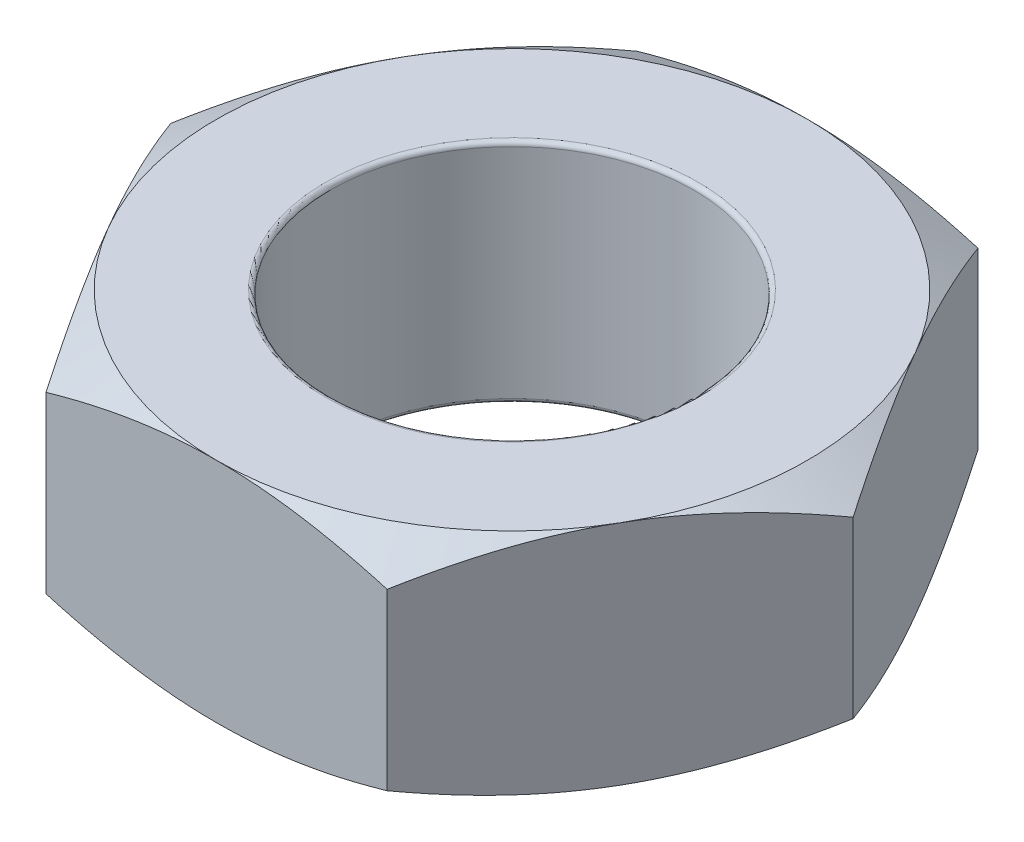
ISO-10303-21;
HEADER;
FILE_DESCRIPTION(('STEP AP214'),'2;1');
FILE_NAME('part.step','',(''),(''),'','','');
FILE_SCHEMA(('AUTOMOTIVE_DESIGN { 1 0 10303 214 1 1 1 1 }'));
ENDSEC;
DATA;
#1=APPLICATION_CONTEXT('core data for automotive mechanical design processes');
#2=APPLICATION_PROTOCOL_DEFINITION('international standard','automotive_design',2000,#1);
#3=PRODUCT_CONTEXT('',#1,'mechanical');
#4=PRODUCT('Part','Part','',(#3));
#5=PRODUCT_RELATED_PRODUCT_CATEGORY('part','',(#4));
#6=PRODUCT_DEFINITION_FORMATION('','',#4);
#7=PRODUCT_DEFINITION_CONTEXT('part definition',#1,'design');
#8=PRODUCT_DEFINITION('design','',#6,#7);
#9=PRODUCT_DEFINITION_SHAPE('','',#8);
#10=(LENGTH_UNIT() NAMED_UNIT(*) SI_UNIT(.MILLI.,.METRE.));
#11=(NAMED_UNIT(*) PLANE_ANGLE_UNIT() SI_UNIT($,.RADIAN.));
#12=(NAMED_UNIT(*) SI_UNIT($,.STERADIAN.) SOLID_ANGLE_UNIT());
#13=UNCERTAINTY_MEASURE_WITH_UNIT(LENGTH_MEASURE(1.E-05),#10,'distance_accuracy_value','');
#14=(GEOMETRIC_REPRESENTATION_CONTEXT(3) GLOBAL_UNCERTAINTY_ASSIGNED_CONTEXT((#13)) GLOBAL_UNIT_ASSIGNED_CONTEXT((#10,
#11,#12)) REPRESENTATION_CONTEXT('',''));
#15=CARTESIAN_POINT('',(0.,0.,0.));
#16=DIRECTION('',(0.,0.,1.));
#17=DIRECTION('',(1.,0.,0.));
#18=AXIS2_PLACEMENT_3D('',#15,#16,#17);
#19=CARTESIAN_POINT('',(-0.938194187433142,1.25,-1.625));
#20=DIRECTION('',(0.866025403784439,0.,0.5));
#21=DIRECTION('',(0.5,0.,-0.866025403784439));
#22=AXIS2_PLACEMENT_3D('',#19,#20,#21);
#23=PLANE('',#22);
#24=CARTESIAN_POINT('',(-1.87650384492012,0.145205818720324,0.000200000000000345));
#25=CARTESIAN_POINT('',(-1.8352739435024,0.121390473504634,-0.0712122840465459));
#26=CARTESIAN_POINT('',(-1.79368815047113,0.0997308271575507,-0.14324099044975));
#27=CARTESIAN_POINT('',(-1.70979637538925,0.0619226455424673,-0.288545807228707));
#28=CARTESIAN_POINT('',(-1.66748890205263,0.0457874872363388,-0.361824500587596));
#29=CARTESIAN_POINT('',(-1.58339830922035,0.0206693238868445,-0.507473679811694));
#30=CARTESIAN_POINT('',(-1.54162813245114,0.0115191685824771,-0.579821748217105));
#31=CARTESIAN_POINT('',(-1.45789110993066,0.000593295685149382,-0.724858525697114));
#32=CARTESIAN_POINT('',(-1.41592456879647,-0.00119146683762475,-0.797546707159463));
#33=CARTESIAN_POINT('',(-1.33749936933626,0.00250991156481871,-0.933383137218262));
#34=CARTESIAN_POINT('',(-1.30102900573519,0.00708723505630447,-0.996551659945832));
#35=CARTESIAN_POINT('',(-1.22832589693122,0.0215982523845244,-1.12247713826252));
#36=CARTESIAN_POINT('',(-1.19209340343042,0.0315369092164136,-1.18523365789081));
#37=CARTESIAN_POINT('',(-1.11924024192611,0.0563841941738891,-1.3114190351083));
#38=CARTESIAN_POINT('',(-1.08262880057288,0.0713982103650805,-1.37483191167041));
#39=CARTESIAN_POINT('',(-1.00995215232964,0.10547466467462,-1.50071155895153));
#40=CARTESIAN_POINT('',(-0.973886013433583,0.124529089463914,-1.56317994395233));
#41=CARTESIAN_POINT('',(-0.938078717379304,0.145205818720324,-1.6252));
#42=B_SPLINE_CURVE_WITH_KNOTS('',3,(#24,#25,#26,#27,#28,#29,#30,#31,#32,#33,#34,#35,#36,#37,#38,
#39,#40,#41),.UNSPECIFIED.,.F.,.F.,(4,2,2,2,2,2,2,2,4),(0.,0.257591322785538,0.51580203617469,
0.767621292271709,1.01913121435468,1.23817526443927,1.45742243279796,1.68153460667234,
1.90520638880478),.UNSPECIFIED.);
#43=CARTESIAN_POINT('',(-1.87638837486628,0.14513914590019,0.));
#44=VERTEX_POINT('',#43);
#45=CARTESIAN_POINT('',(-1.40729128114971,0.,-0.8125));
#46=VERTEX_POINT('',#45);
#47=EDGE_CURVE('E374',#44,#46,#42,.T.);
#48=ORIENTED_EDGE('',*,*,#47,.F.);
#49=DIRECTION('',(0.,-1.,0.));
#50=VECTOR('',#49,1.);
#51=CARTESIAN_POINT('',(-1.87638837486628,1.25,0.));
#52=LINE('',#51,#50);
#53=CARTESIAN_POINT('',(-1.87638837486628,1.10486085409981,0.));
#54=VERTEX_POINT('',#53);
#55=EDGE_CURVE('E318',#54,#44,#52,.T.);
#56=ORIENTED_EDGE('',*,*,#55,.F.);
#57=CARTESIAN_POINT('',(-0.938078717379304,1.10479418127968,-1.6252));
#58=CARTESIAN_POINT('',(-0.979308618797023,1.12860952649537,-1.55378771595345));
#59=CARTESIAN_POINT('',(-1.02089441182829,1.15026917284245,-1.48175900955025));
#60=CARTESIAN_POINT('',(-1.10478618691017,1.18807735445753,-1.33645419277129));
#61=CARTESIAN_POINT('',(-1.14709366024679,1.20421251276366,-1.2631754994124));
#62=CARTESIAN_POINT('',(-1.23118425307907,1.22933067611316,-1.11752632018831));
#63=CARTESIAN_POINT('',(-1.27295442984829,1.23848083141752,-1.04517825178289));
#64=CARTESIAN_POINT('',(-1.35669145236877,1.24940670431485,-0.900141474302885));
#65=CARTESIAN_POINT('',(-1.39865799350296,1.25119146683762,-0.827453292840537));
#66=CARTESIAN_POINT('',(-1.47708319296316,1.24749008843518,-0.691616862781737));
#67=CARTESIAN_POINT('',(-1.51355355656424,1.2429127649437,-0.628448340054167));
#68=CARTESIAN_POINT('',(-1.58625666536821,1.22840174761548,-0.502522861737482));
#69=CARTESIAN_POINT('',(-1.62248915886901,1.21846309078359,-0.439766342109185));
#70=CARTESIAN_POINT('',(-1.69534232037332,1.19361580582611,-0.313580964891704));
#71=CARTESIAN_POINT('',(-1.73195376172654,1.17860178963492,-0.250168088329588));
#72=CARTESIAN_POINT('',(-1.80463040996979,1.14452533532538,-0.124288441048471));
#73=CARTESIAN_POINT('',(-1.84069654886584,1.12547091053609,-0.0618200560476711));
#74=CARTESIAN_POINT('',(-1.87650384492012,1.10479418127968,0.000200000000000298));
#75=B_SPLINE_CURVE_WITH_KNOTS('',3,(#57,#58,#59,#60,#61,#62,#63,#64,#65,#66,#67,#68,#69,#70,#71,
#72,#73,#74),.UNSPECIFIED.,.F.,.F.,(4,2,2,2,2,2,2,2,4),(0.,0.257591322785538,0.51580203617469,
0.767621292271709,1.01913121435468,1.23817526443927,1.45742243279796,1.68153460667234,
1.90520638880478),.UNSPECIFIED.);
#76=CARTESIAN_POINT('',(-1.40729128114971,1.25,-0.8125));
#77=VERTEX_POINT('',#76);
#78=EDGE_CURVE('E257',#77,#54,#75,.T.);
#79=ORIENTED_EDGE('',*,*,#78,.F.);
#80=CARTESIAN_POINT('',(-0.938194187433168,1.10486085409982,-1.625));
#81=VERTEX_POINT('',#80);
#82=EDGE_CURVE('E331',#81,#77,#75,.T.);
#83=ORIENTED_EDGE('',*,*,#82,.F.);
#84=DIRECTION('',(0.,-1.,0.));
#85=VECTOR('',#84,1.);
#86=CARTESIAN_POINT('',(-0.938194187433142,1.25,-1.625));
#87=LINE('',#86,#85);
#88=CARTESIAN_POINT('',(-0.938194187433142,0.14513914590019,-1.625));
#89=VERTEX_POINT('',#88);
#90=EDGE_CURVE('E329',#81,#89,#87,.T.);
#91=ORIENTED_EDGE('',*,*,#90,.T.);
#92=EDGE_CURVE('E211',#46,#89,#42,.T.);
#93=ORIENTED_EDGE('',*,*,#92,.F.);
#94=EDGE_LOOP('',(#48,#56,#79,#83,#91,#93));
#95=FACE_BOUND('',#94,.T.);
#96=ADVANCED_FACE('F37',(#95),#23,.F.);
#97=CARTESIAN_POINT('',(-1.87638837486628,1.25,0.));
#98=DIRECTION('',(0.866025403784439,0.,-0.5));
#99=DIRECTION('',(-0.5,0.,-0.866025403784439));
#100=AXIS2_PLACEMENT_3D('',#97,#98,#99);
#101=PLANE('',#100);
#102=CARTESIAN_POINT('',(-0.938078717379304,0.145205818720324,1.6252));
#103=CARTESIAN_POINT('',(-0.979308618797023,0.121390473504634,1.55378771595345));
#104=CARTESIAN_POINT('',(-1.02089441182829,0.0997308271575508,1.48175900955025));
#105=CARTESIAN_POINT('',(-1.10478618691017,0.0619226455424675,1.33645419277129));
#106=CARTESIAN_POINT('',(-1.14709366024679,0.0457874872363389,1.2631754994124));
#107=CARTESIAN_POINT('',(-1.23118425307907,0.0206693238868445,1.11752632018831));
#108=CARTESIAN_POINT('',(-1.27295442984829,0.0115191685824771,1.04517825178289));
#109=CARTESIAN_POINT('',(-1.35669145236877,0.000593295685149403,0.900141474302885));
#110=CARTESIAN_POINT('',(-1.39865799350296,-0.00119146683762467,0.827453292840537));
#111=CARTESIAN_POINT('',(-1.47708319296316,0.00250991156481875,0.691616862781738));
#112=CARTESIAN_POINT('',(-1.51355355656424,0.00708723505630443,0.628448340054167));
#113=CARTESIAN_POINT('',(-1.58625666536821,0.0215982523845243,0.502522861737483));
#114=CARTESIAN_POINT('',(-1.62248915886901,0.0315369092164135,0.439766342109186));
#115=CARTESIAN_POINT('',(-1.69534232037332,0.0563841941738891,0.313580964891705));
#116=CARTESIAN_POINT('',(-1.73195376172654,0.0713982103650805,0.250168088329589));
#117=CARTESIAN_POINT('',(-1.80463040996979,0.10547466467462,0.124288441048472));
#118=CARTESIAN_POINT('',(-1.84069654886584,0.124529089463914,0.0618200560476719));
#119=CARTESIAN_POINT('',(-1.87650384492012,0.145205818720324,-0.00019999999999945));
#120=B_SPLINE_CURVE_WITH_KNOTS('',3,(#102,#103,#104,#105,#106,#107,#108,#109,#110,#111,#112,
#113,#114,#115,#116,#117,#118,#119),.UNSPECIFIED.,.F.,.F.,(4,2,2,2,2,2,2,2,4),(0.,
0.257591322785537,0.515802036174689,0.767621292271709,1.01913121435468,1.23817526443927,
1.45742243279796,1.68153460667234,1.90520638880478),.UNSPECIFIED.);
#121=CARTESIAN_POINT('',(-0.938194187433142,0.14513914590019,1.625));
#122=VERTEX_POINT('',#121);
#123=CARTESIAN_POINT('',(-1.40729128114971,0.,0.8125));
#124=VERTEX_POINT('',#123);
#125=EDGE_CURVE('E147',#122,#124,#120,.T.);
#126=ORIENTED_EDGE('',*,*,#125,.F.);
#127=DIRECTION('',(0.,-1.,0.));
#128=VECTOR('',#127,1.);
#129=CARTESIAN_POINT('',(-0.938194187433142,1.25,1.625));
#130=LINE('',#129,#128);
#131=CARTESIAN_POINT('',(-0.938194187433142,1.10486085409981,1.625));
#132=VERTEX_POINT('',#131);
#133=EDGE_CURVE('E162',#132,#122,#130,.T.);
#134=ORIENTED_EDGE('',*,*,#133,.F.);
#135=CARTESIAN_POINT('',(-1.87650384492012,1.10479418127968,-0.000199999999999606));
#136=CARTESIAN_POINT('',(-1.8352739435024,1.12860952649537,0.0712122840465465));
#137=CARTESIAN_POINT('',(-1.79368815047113,1.15026917284245,0.143240990449751));
#138=CARTESIAN_POINT('',(-1.70979637538925,1.18807735445753,0.288545807228708));
#139=CARTESIAN_POINT('',(-1.66748890205263,1.20421251276366,0.361824500587597));
#140=CARTESIAN_POINT('',(-1.58339830922035,1.22933067611316,0.507473679811695));
#141=CARTESIAN_POINT('',(-1.54162813245114,1.23848083141752,0.579821748217106));
#142=CARTESIAN_POINT('',(-1.45789110993066,1.24940670431485,0.724858525697115));
#143=CARTESIAN_POINT('',(-1.41592456879647,1.25119146683762,0.797546707159463));
#144=CARTESIAN_POINT('',(-1.33749936933626,1.24749008843518,0.933383137218262));
#145=CARTESIAN_POINT('',(-1.30102900573519,1.2429127649437,0.996551659945833));
#146=CARTESIAN_POINT('',(-1.22832589693122,1.22840174761548,1.12247713826252));
#147=CARTESIAN_POINT('',(-1.19209340343042,1.21846309078359,1.18523365789081));
#148=CARTESIAN_POINT('',(-1.11924024192611,1.19361580582611,1.3114190351083));
#149=CARTESIAN_POINT('',(-1.08262880057288,1.17860178963492,1.37483191167041));
#150=CARTESIAN_POINT('',(-1.00995215232964,1.14452533532538,1.50071155895153));
#151=CARTESIAN_POINT('',(-0.973886013433583,1.12547091053609,1.56317994395233));
#152=CARTESIAN_POINT('',(-0.938078717379304,1.10479418127968,1.6252));
#153=B_SPLINE_CURVE_WITH_KNOTS('',3,(#135,#136,#137,#138,#139,#140,#141,#142,#143,#144,#145,
#146,#147,#148,#149,#150,#151,#152),.UNSPECIFIED.,.F.,.F.,(4,2,2,2,2,2,2,2,4),(0.,
0.257591322785538,0.515802036174689,0.767621292271709,1.01913121435468,1.23817526443927,
1.45742243279796,1.68153460667234,1.90520638880478),.UNSPECIFIED.);
#154=CARTESIAN_POINT('',(-1.40729128114971,1.25,0.8125));
#155=VERTEX_POINT('',#154);
#156=EDGE_CURVE('E250',#155,#132,#153,.T.);
#157=ORIENTED_EDGE('',*,*,#156,.F.);
#158=EDGE_CURVE('E256',#54,#155,#153,.T.);
#159=ORIENTED_EDGE('',*,*,#158,.F.);
#160=ORIENTED_EDGE('',*,*,#55,.T.);
#161=EDGE_CURVE('E172',#124,#44,#120,.T.);
#162=ORIENTED_EDGE('',*,*,#161,.F.);
#163=EDGE_LOOP('',(#126,#134,#157,#159,#160,#162));
#164=FACE_BOUND('',#163,.T.);
#165=ADVANCED_FACE('F263',(#164),#101,.F.);
#166=CARTESIAN_POINT('',(-0.938194187433142,1.25,1.625));
#167=DIRECTION('',(0.,0.,-1.));
#168=DIRECTION('',(-1.,0.,0.));
#169=AXIS2_PLACEMENT_3D('',#166,#167,#168);
#170=PLANE('',#169);
#171=CARTESIAN_POINT('',(3.06461932446199,1.06451369639696,1.625));
#172=CARTESIAN_POINT('',(2.99266321340277,1.02781396950948,1.625));
#173=CARTESIAN_POINT('',(2.92059482883447,0.991333085105899,1.625));
#174=CARTESIAN_POINT('',(2.77618465149806,0.91891277317124,1.625));
#175=CARTESIAN_POINT('',(2.70384285261425,0.882973357842408,1.625));
#176=CARTESIAN_POINT('',(2.48608615671299,0.776001286039627,1.625));
#177=CARTESIAN_POINT('',(2.34019048036907,0.70594347845191,1.625));
#178=CARTESIAN_POINT('',(2.03920029786265,0.566294087447163,1.625));
#179=CARTESIAN_POINT('',(1.88401151069048,0.496902232916793,1.625));
#180=CARTESIAN_POINT('',(1.64903988412889,0.39810957050653,1.625));
#181=CARTESIAN_POINT('',(1.57037153939657,0.366068674074215,1.625));
#182=CARTESIAN_POINT('',(1.41213727100994,0.304296361847485,1.625));
#183=CARTESIAN_POINT('',(1.33257143948631,0.274564711426511,1.625));
#184=CARTESIAN_POINT('',(1.15745973632128,0.21284425961324,1.625));
#185=CARTESIAN_POINT('',(1.06169560285612,0.181465107172809,1.625));
#186=CARTESIAN_POINT('',(0.868477831968372,0.124505293620371,1.625));
#187=CARTESIAN_POINT('',(0.771025131481209,0.0989215211536994,1.625));
#188=CARTESIAN_POINT('',(0.576165925834076,0.0558982937282068,1.625));
#189=CARTESIAN_POINT('',(0.478791504082427,0.0383177674879927,1.625));
#190=CARTESIAN_POINT('',(0.282815812464951,0.0125151445115495,1.625));
#191=CARTESIAN_POINT('',(0.184215246512044,0.00428790812269243,1.625));
#192=CARTESIAN_POINT('',(-0.0143923704359808,-0.0017280861808427,1.625));
#193=CARTESIAN_POINT('',(-0.114403064252139,0.000597527005029433,1.625));
#194=CARTESIAN_POINT('',(-0.313649366243174,0.0156074561713315,1.625));
#195=CARTESIAN_POINT('',(-0.412884637291483,0.0282960493858252,1.625));
#196=CARTESIAN_POINT('',(-0.611690900026707,0.0627377911949842,1.625));
#197=CARTESIAN_POINT('',(-0.711231271287667,0.0846614918747451,1.625));
#198=CARTESIAN_POINT('',(-0.908495275655247,0.135456280719985,1.625));
#199=CARTESIAN_POINT('',(-1.0062185414646,0.164328757366507,1.625));
#200=CARTESIAN_POINT('',(-1.19047089471755,0.22407730654349,1.625));
#201=CARTESIAN_POINT('',(-1.27715699415366,0.254478309764394,1.625));
#202=CARTESIAN_POINT('',(-1.44938423051238,0.31838674237641,1.625));
#203=CARTESIAN_POINT('',(-1.53492515781266,0.351894731835269,1.625));
#204=CARTESIAN_POINT('',(-1.70512012466827,0.421269901835406,1.625));
#205=CARTESIAN_POINT('',(-1.78977337376449,0.457139007147671,1.625));
#206=CARTESIAN_POINT('',(-1.9583059527585,0.530653631692472,1.625));
#207=CARTESIAN_POINT('',(-2.04218524687468,0.568299232569161,1.625));
#208=CARTESIAN_POINT('',(-2.20498457533495,0.642973011466076,1.625));
#209=CARTESIAN_POINT('',(-2.28393640330809,0.679932135392385,1.625));
#210=CARTESIAN_POINT('',(-2.44137718682998,0.754826749383717,1.625));
#211=CARTESIAN_POINT('',(-2.51986613014218,0.792762265119124,1.625));
#212=CARTESIAN_POINT('',(-2.67624887200489,0.869310001130827,1.625));
#213=CARTESIAN_POINT('',(-2.75414370700355,0.907920108745872,1.625));
#214=CARTESIAN_POINT('',(-2.90960832767825,0.985774941910632,1.625));
#215=CARTESIAN_POINT('',(-2.98717813787397,1.02501961846258,1.625));
#216=CARTESIAN_POINT('',(-3.06461932446199,1.06451369639696,1.625));
#217=B_SPLINE_CURVE_WITH_KNOTS('',3,(#171,#172,#173,#174,#175,#176,#177,#178,#179,#180,#181,
#182,#183,#184,#185,#186,#187,#188,#189,#190,#191,#192,#193,#194,#195,#196,#197,#198,#199,#200,
#201,#202,#203,#204,#205,#206,#207,#208,#209,#210,#211,#212,#213,#214,#215,#216),.UNSPECIFIED.,
.F.,.F.,(4,2,2,2,2,2,2,2,2,2,2,2,2,2,2,2,2,2,2,2,2,2,4),(0.,0.242324436741993,0.484654326230032,
0.97015888941233,1.48002127441094,1.73482298164268,1.98959876627194,2.29178838963912,
2.59381539049249,2.89029023163734,3.18660208036426,3.48613296162007,3.78578753427841,
4.09123706182882,4.39674767402384,4.67226144495932,4.94782497713089,5.2236159980951,
5.49941970622591,5.7609347310771,6.02245663847516,6.28326976526984,6.54406284884171),.UNSPECIFIED.);
#218=CARTESIAN_POINT('',(0.938194187433142,0.14513914590019,1.625));
#219=VERTEX_POINT('',#218);
#220=CARTESIAN_POINT('',(0.,0.,1.625));
#221=VERTEX_POINT('',#220);
#222=EDGE_CURVE('E126',#219,#221,#217,.T.);
#223=ORIENTED_EDGE('',*,*,#222,.F.);
#224=DIRECTION('',(0.,-1.,0.));
#225=VECTOR('',#224,1.);
#226=CARTESIAN_POINT('',(0.938194187433142,1.25,1.625));
#227=LINE('',#226,#225);
#228=CARTESIAN_POINT('',(0.938194187433142,1.10486085409981,1.625));
#229=VERTEX_POINT('',#228);
#230=EDGE_CURVE('E322',#229,#219,#227,.T.);
#231=ORIENTED_EDGE('',*,*,#230,.F.);
#232=CARTESIAN_POINT('',(-3.06461932446199,0.185486303603036,1.625));
#233=CARTESIAN_POINT('',(-2.99266321340277,0.222186030490522,1.625));
#234=CARTESIAN_POINT('',(-2.92059482883447,0.258666914894101,1.625));
#235=CARTESIAN_POINT('',(-2.77618465149806,0.33108722682876,1.625));
#236=CARTESIAN_POINT('',(-2.70384285261425,0.367026642157592,1.625));
#237=CARTESIAN_POINT('',(-2.48608615671299,0.473998713960373,1.625));
#238=CARTESIAN_POINT('',(-2.34019048036907,0.54405652154809,1.625));
#239=CARTESIAN_POINT('',(-2.03920029786265,0.683705912552837,1.625));
#240=CARTESIAN_POINT('',(-1.88401151069048,0.753097767083207,1.625));
#241=CARTESIAN_POINT('',(-1.64903988412889,0.851890429493469,1.625));
#242=CARTESIAN_POINT('',(-1.57037153939657,0.883931325925785,1.625));
#243=CARTESIAN_POINT('',(-1.41213727100994,0.945703638152515,1.625));
#244=CARTESIAN_POINT('',(-1.33257143948631,0.975435288573489,1.625));
#245=CARTESIAN_POINT('',(-1.15745973632128,1.03715574038676,1.625));
#246=CARTESIAN_POINT('',(-1.06169560285612,1.06853489282719,1.625));
#247=CARTESIAN_POINT('',(-0.868477831968372,1.12549470637963,1.625));
#248=CARTESIAN_POINT('',(-0.771025131481209,1.1510784788463,1.625));
#249=CARTESIAN_POINT('',(-0.576165925834076,1.19410170627179,1.625));
#250=CARTESIAN_POINT('',(-0.478791504082427,1.21168223251201,1.625));
#251=CARTESIAN_POINT('',(-0.282815812464951,1.23748485548845,1.625));
#252=CARTESIAN_POINT('',(-0.184215246512045,1.24571209187731,1.625));
#253=CARTESIAN_POINT('',(0.0143923704359805,1.25172808618084,1.625));
#254=CARTESIAN_POINT('',(0.114403064252138,1.24940247299497,1.625));
#255=CARTESIAN_POINT('',(0.313649366243173,1.23439254382867,1.625));
#256=CARTESIAN_POINT('',(0.412884637291483,1.22170395061418,1.625));
#257=CARTESIAN_POINT('',(0.611690900026706,1.18726220880502,1.625));
#258=CARTESIAN_POINT('',(0.711231271287667,1.16533850812525,1.625));
#259=CARTESIAN_POINT('',(0.908495275655247,1.11454371928001,1.625));
#260=CARTESIAN_POINT('',(1.0062185414646,1.08567124263349,1.625));
#261=CARTESIAN_POINT('',(1.19047089471755,1.02592269345651,1.625));
#262=CARTESIAN_POINT('',(1.27715699415365,0.995521690235606,1.625));
#263=CARTESIAN_POINT('',(1.44938423051238,0.93161325762359,1.625));
#264=CARTESIAN_POINT('',(1.53492515781266,0.898105268164731,1.625));
#265=CARTESIAN_POINT('',(1.70512012466827,0.828730098164594,1.625));
#266=CARTESIAN_POINT('',(1.78977337376449,0.792860992852329,1.625));
#267=CARTESIAN_POINT('',(1.9583059527585,0.719346368307528,1.625));
#268=CARTESIAN_POINT('',(2.04218524687468,0.681700767430839,1.625));
#269=CARTESIAN_POINT('',(2.20498457533495,0.607026988533924,1.625));
#270=CARTESIAN_POINT('',(2.28393640330809,0.570067864607615,1.625));
#271=CARTESIAN_POINT('',(2.44137718682998,0.495173250616283,1.625));
#272=CARTESIAN_POINT('',(2.51986613014218,0.457237734880876,1.625));
#273=CARTESIAN_POINT('',(2.67624887200489,0.380689998869173,1.625));
#274=CARTESIAN_POINT('',(2.75414370700355,0.342079891254128,1.625));
#275=CARTESIAN_POINT('',(2.90960832767825,0.264225058089368,1.625));
#276=CARTESIAN_POINT('',(2.98717813787397,0.224980381537416,1.625));
#277=CARTESIAN_POINT('',(3.06461932446199,0.185486303603036,1.625));
#278=B_SPLINE_CURVE_WITH_KNOTS('',3,(#232,#233,#234,#235,#236,#237,#238,#239,#240,#241,#242,
#243,#244,#245,#246,#247,#248,#249,#250,#251,#252,#253,#254,#255,#256,#257,#258,#259,#260,#261,
#262,#263,#264,#265,#266,#267,#268,#269,#270,#271,#272,#273,#274,#275,#276,#277),.UNSPECIFIED.,
.F.,.F.,(4,2,2,2,2,2,2,2,2,2,2,2,2,2,2,2,2,2,2,2,2,2,4),(0.,0.242324436741993,0.484654326230032,
0.970158889412329,1.48002127441094,1.73482298164268,1.98959876627194,2.29178838963912,
2.59381539049249,2.89029023163734,3.18660208036426,3.48613296162007,3.78578753427841,
4.09123706182881,4.39674767402384,4.67226144495932,4.94782497713088,5.22361599809509,
5.49941970622591,5.7609347310771,6.02245663847516,6.28326976526984,6.54406284884171),.UNSPECIFIED.);
#279=CARTESIAN_POINT('',(0.,1.25,1.625));
#280=VERTEX_POINT('',#279);
#281=EDGE_CURVE('E243',#280,#229,#278,.T.);
#282=ORIENTED_EDGE('',*,*,#281,.F.);
#283=EDGE_CURVE('E249',#132,#280,#278,.T.);
#284=ORIENTED_EDGE('',*,*,#283,.F.);
#285=ORIENTED_EDGE('',*,*,#133,.T.);
#286=EDGE_CURVE('E139',#221,#122,#217,.T.);
#287=ORIENTED_EDGE('',*,*,#286,.F.);
#288=EDGE_LOOP('',(#223,#231,#282,#284,#285,#287));
#289=FACE_BOUND('',#288,.T.);
#290=ADVANCED_FACE('F159',(#289),#170,.F.);
#291=CARTESIAN_POINT('',(0.938194187433142,1.25,1.625));
#292=DIRECTION('',(-0.866025403784439,0.,-0.5));
#293=DIRECTION('',(-0.5,0.,0.866025403784439));
#294=AXIS2_PLACEMENT_3D('',#291,#292,#293);
#295=PLANE('',#294);
#296=CARTESIAN_POINT('',(1.87650384492012,0.145205818720324,-0.00020000000000057));
#297=CARTESIAN_POINT('',(1.8352739435024,0.121390473504634,0.0712122840465456));
#298=CARTESIAN_POINT('',(1.79368815047113,0.0997308271575505,0.14324099044975));
#299=CARTESIAN_POINT('',(1.70979637538925,0.0619226455424671,0.288545807228707));
#300=CARTESIAN_POINT('',(1.66748890205263,0.0457874872363385,0.361824500587596));
#301=CARTESIAN_POINT('',(1.58339830922035,0.0206693238868443,0.507473679811694));
#302=CARTESIAN_POINT('',(1.54162813245114,0.011519168582477,0.579821748217105));
#303=CARTESIAN_POINT('',(1.45789110993066,0.00059329568514934,0.724858525697114));
#304=CARTESIAN_POINT('',(1.41592456879647,-0.00119146683762486,0.797546707159462));
#305=CARTESIAN_POINT('',(1.33749936933626,0.00250991156481852,0.933383137218262));
#306=CARTESIAN_POINT('',(1.30102900573519,0.00708723505630428,0.996551659945832));
#307=CARTESIAN_POINT('',(1.22832589693122,0.0215982523845243,1.12247713826252));
#308=CARTESIAN_POINT('',(1.19209340343042,0.0315369092164135,1.18523365789081));
#309=CARTESIAN_POINT('',(1.11924024192611,0.056384194173889,1.31141903510829));
#310=CARTESIAN_POINT('',(1.08262880057288,0.0713982103650805,1.37483191167041));
#311=CARTESIAN_POINT('',(1.00995215232964,0.10547466467462,1.50071155895153));
#312=CARTESIAN_POINT('',(0.973886013433583,0.124529089463914,1.56317994395233));
#313=CARTESIAN_POINT('',(0.938078717379304,0.145205818720325,1.6252));
#314=B_SPLINE_CURVE_WITH_KNOTS('',3,(#296,#297,#298,#299,#300,#301,#302,#303,#304,#305,#306,
#307,#308,#309,#310,#311,#312,#313),.UNSPECIFIED.,.F.,.F.,(4,2,2,2,2,2,2,2,4),(0.,
0.257591322785538,0.515802036174689,0.767621292271709,1.01913121435467,1.23817526443927,
1.45742243279796,1.68153460667234,1.90520638880478),.UNSPECIFIED.);
#315=CARTESIAN_POINT('',(1.87638837486628,0.14513914590019,0.));
#316=VERTEX_POINT('',#315);
#317=CARTESIAN_POINT('',(1.40729128114971,0.,0.8125));
#318=VERTEX_POINT('',#317);
#319=EDGE_CURVE('E52',#316,#318,#314,.T.);
#320=ORIENTED_EDGE('',*,*,#319,.F.);
#321=DIRECTION('',(0.,-1.,0.));
#322=VECTOR('',#321,1.);
#323=CARTESIAN_POINT('',(1.87638837486628,1.25,0.));
#324=LINE('',#323,#322);
#325=CARTESIAN_POINT('',(1.87638837486628,1.10486085409981,0.));
#326=VERTEX_POINT('',#325);
#327=EDGE_CURVE('E324',#326,#316,#324,.T.);
#328=ORIENTED_EDGE('',*,*,#327,.F.);
#329=CARTESIAN_POINT('',(0.938078717379304,1.10479418127968,1.6252));
#330=CARTESIAN_POINT('',(0.979308618797023,1.12860952649537,1.55378771595345));
#331=CARTESIAN_POINT('',(1.02089441182829,1.15026917284245,1.48175900955025));
#332=CARTESIAN_POINT('',(1.10478618691017,1.18807735445753,1.33645419277129));
#333=CARTESIAN_POINT('',(1.14709366024679,1.20421251276366,1.2631754994124));
#334=CARTESIAN_POINT('',(1.23118425307907,1.22933067611316,1.11752632018831));
#335=CARTESIAN_POINT('',(1.27295442984829,1.23848083141752,1.04517825178289));
#336=CARTESIAN_POINT('',(1.35669145236877,1.24940670431485,0.900141474302885));
#337=CARTESIAN_POINT('',(1.39865799350296,1.25119146683762,0.827453292840537));
#338=CARTESIAN_POINT('',(1.47708319296316,1.24749008843518,0.691616862781737));
#339=CARTESIAN_POINT('',(1.51355355656424,1.2429127649437,0.628448340054166));
#340=CARTESIAN_POINT('',(1.58625666536821,1.22840174761548,0.502522861737482));
#341=CARTESIAN_POINT('',(1.62248915886901,1.21846309078359,0.439766342109185));
#342=CARTESIAN_POINT('',(1.69534232037331,1.19361580582611,0.313580964891704));
#343=CARTESIAN_POINT('',(1.73195376172654,1.17860178963492,0.250168088329588));
#344=CARTESIAN_POINT('',(1.80463040996979,1.14452533532538,0.124288441048471));
#345=CARTESIAN_POINT('',(1.84069654886584,1.12547091053609,0.0618200560476707));
#346=CARTESIAN_POINT('',(1.87650384492012,1.10479418127968,-0.000200000000000683));
#347=B_SPLINE_CURVE_WITH_KNOTS('',3,(#329,#330,#331,#332,#333,#334,#335,#336,#337,#338,#339,
#340,#341,#342,#343,#344,#345,#346),.UNSPECIFIED.,.F.,.F.,(4,2,2,2,2,2,2,2,4),(0.,
0.257591322785538,0.51580203617469,0.767621292271709,1.01913121435468,1.23817526443927,
1.45742243279796,1.68153460667234,1.90520638880478),.UNSPECIFIED.);
#348=CARTESIAN_POINT('',(1.40729128114971,1.25,0.812499999999999));
#349=VERTEX_POINT('',#348);
#350=EDGE_CURVE('E230',#349,#326,#347,.T.);
#351=ORIENTED_EDGE('',*,*,#350,.F.);
#352=EDGE_CURVE('E236',#229,#349,#347,.T.);
#353=ORIENTED_EDGE('',*,*,#352,.F.);
#354=ORIENTED_EDGE('',*,*,#230,.T.);
#355=EDGE_CURVE('E133',#318,#219,#314,.T.);
#356=ORIENTED_EDGE('',*,*,#355,.F.);
#357=EDGE_LOOP('',(#320,#328,#351,#353,#354,#356));
#358=FACE_BOUND('',#357,.T.);
#359=ADVANCED_FACE('F222',(#358),#295,.F.);
#360=CARTESIAN_POINT('',(1.87638837486628,1.25,0.));
#361=DIRECTION('',(-0.866025403784439,0.,0.5));
#362=DIRECTION('',(0.5,0.,0.866025403784439));
#363=AXIS2_PLACEMENT_3D('',#360,#361,#362);
#364=PLANE('',#363);
#365=CARTESIAN_POINT('',(0.938078717379304,0.145205818720324,-1.6252));
#366=CARTESIAN_POINT('',(0.979308618797023,0.121390473504634,-1.55378771595345));
#367=CARTESIAN_POINT('',(1.02089441182829,0.0997308271575508,-1.48175900955025));
#368=CARTESIAN_POINT('',(1.10478618691017,0.0619226455424673,-1.33645419277129));
#369=CARTESIAN_POINT('',(1.14709366024679,0.0457874872363388,-1.2631754994124));
#370=CARTESIAN_POINT('',(1.23118425307907,0.0206693238868445,-1.11752632018831));
#371=CARTESIAN_POINT('',(1.27295442984829,0.0115191685824771,-1.04517825178289));
#372=CARTESIAN_POINT('',(1.35669145236877,0.000593295685149365,-0.900141474302885));
#373=CARTESIAN_POINT('',(1.39865799350296,-0.00119146683762485,-0.827453292840537));
#374=CARTESIAN_POINT('',(1.47708319296316,0.00250991156481862,-0.691616862781738));
#375=CARTESIAN_POINT('',(1.51355355656424,0.00708723505630446,-0.628448340054167));
#376=CARTESIAN_POINT('',(1.58625666536821,0.0215982523845244,-0.502522861737483));
#377=CARTESIAN_POINT('',(1.62248915886901,0.0315369092164135,-0.439766342109186));
#378=CARTESIAN_POINT('',(1.69534232037331,0.0563841941738889,-0.313580964891705));
#379=CARTESIAN_POINT('',(1.73195376172654,0.0713982103650804,-0.250168088329589));
#380=CARTESIAN_POINT('',(1.80463040996979,0.10547466467462,-0.124288441048472));
#381=CARTESIAN_POINT('',(1.84069654886584,0.124529089463914,-0.0618200560476721));
#382=CARTESIAN_POINT('',(1.87650384492012,0.145205818720324,0.000199999999999229));
#383=B_SPLINE_CURVE_WITH_KNOTS('',3,(#365,#366,#367,#368,#369,#370,#371,#372,#373,#374,#375,
#376,#377,#378,#379,#380,#381,#382),.UNSPECIFIED.,.F.,.F.,(4,2,2,2,2,2,2,2,4),(0.,
0.257591322785538,0.51580203617469,0.767621292271709,1.01913121435468,1.23817526443927,
1.45742243279796,1.68153460667233,1.90520638880478),.UNSPECIFIED.);
#384=CARTESIAN_POINT('',(0.938194187433167,0.145139145900175,-1.625));
#385=VERTEX_POINT('',#384);
#386=CARTESIAN_POINT('',(1.40729128114971,0.,-0.8125));
#387=VERTEX_POINT('',#386);
#388=EDGE_CURVE('E60',#385,#387,#383,.T.);
#389=ORIENTED_EDGE('',*,*,#388,.F.);
#390=DIRECTION('',(0.,-1.,0.));
#391=VECTOR('',#390,1.);
#392=CARTESIAN_POINT('',(0.938194187433142,1.25,-1.625));
#393=LINE('',#392,#391);
#394=CARTESIAN_POINT('',(0.938194187433142,1.10486085409981,-1.625));
#395=VERTEX_POINT('',#394);
#396=EDGE_CURVE('E327',#395,#385,#393,.T.);
#397=ORIENTED_EDGE('',*,*,#396,.F.);
#398=CARTESIAN_POINT('',(1.87650384492012,1.10479418127968,0.000199999999999411));
#399=CARTESIAN_POINT('',(1.8352739435024,1.12860952649537,-0.0712122840465468));
#400=CARTESIAN_POINT('',(1.79368815047113,1.15026917284245,-0.143240990449751));
#401=CARTESIAN_POINT('',(1.70979637538925,1.18807735445753,-0.288545807228708));
#402=CARTESIAN_POINT('',(1.66748890205263,1.20421251276366,-0.361824500587597));
#403=CARTESIAN_POINT('',(1.58339830922035,1.22933067611316,-0.507473679811695));
#404=CARTESIAN_POINT('',(1.54162813245114,1.23848083141752,-0.579821748217106));
#405=CARTESIAN_POINT('',(1.45789110993066,1.24940670431485,-0.724858525697115));
#406=CARTESIAN_POINT('',(1.41592456879647,1.25119146683762,-0.797546707159463));
#407=CARTESIAN_POINT('',(1.33749936933626,1.24749008843518,-0.933383137218263));
#408=CARTESIAN_POINT('',(1.30102900573519,1.2429127649437,-0.996551659945833));
#409=CARTESIAN_POINT('',(1.22832589693122,1.22840174761548,-1.12247713826252));
#410=CARTESIAN_POINT('',(1.19209340343042,1.21846309078359,-1.18523365789081));
#411=CARTESIAN_POINT('',(1.11924024192611,1.19361580582611,-1.3114190351083));
#412=CARTESIAN_POINT('',(1.08262880057288,1.17860178963492,-1.37483191167041));
#413=CARTESIAN_POINT('',(1.00995215232964,1.14452533532538,-1.50071155895153));
#414=CARTESIAN_POINT('',(0.973886013433583,1.12547091053609,-1.56317994395233));
#415=CARTESIAN_POINT('',(0.938078717379304,1.10479418127968,-1.6252));
#416=B_SPLINE_CURVE_WITH_KNOTS('',3,(#398,#399,#400,#401,#402,#403,#404,#405,#406,#407,#408,
#409,#410,#411,#412,#413,#414,#415),.UNSPECIFIED.,.F.,.F.,(4,2,2,2,2,2,2,2,4),(0.,
0.257591322785538,0.51580203617469,0.767621292271709,1.01913121435468,1.23817526443927,
1.45742243279796,1.68153460667234,1.90520638880478),.UNSPECIFIED.);
#417=CARTESIAN_POINT('',(1.40729128114971,1.25,-0.8125));
#418=VERTEX_POINT('',#417);
#419=EDGE_CURVE('E238',#418,#395,#416,.T.);
#420=ORIENTED_EDGE('',*,*,#419,.F.);
#421=EDGE_CURVE('E237',#326,#418,#416,.T.);
#422=ORIENTED_EDGE('',*,*,#421,.F.);
#423=ORIENTED_EDGE('',*,*,#327,.T.);
#424=EDGE_CURVE('E221',#387,#316,#383,.T.);
#425=ORIENTED_EDGE('',*,*,#424,.F.);
#426=EDGE_LOOP('',(#389,#397,#420,#422,#423,#425));
#427=FACE_BOUND('',#426,.T.);
#428=ADVANCED_FACE('F225',(#427),#364,.F.);
#429=CARTESIAN_POINT('',(0.938194187433142,1.25,-1.625));
#430=DIRECTION('',(0.,0.,1.));
#431=DIRECTION('',(1.,0.,0.));
#432=AXIS2_PLACEMENT_3D('',#429,#430,#431);
#433=PLANE('',#432);
#434=CARTESIAN_POINT('',(-3.06461932446199,1.06451369639696,-1.625));
#435=CARTESIAN_POINT('',(-2.99266321340277,1.02781396950948,-1.625));
#436=CARTESIAN_POINT('',(-2.92059482883447,0.991333085105899,-1.625));
#437=CARTESIAN_POINT('',(-2.77618465149806,0.91891277317124,-1.625));
#438=CARTESIAN_POINT('',(-2.70384285261425,0.882973357842408,-1.625));
#439=CARTESIAN_POINT('',(-2.48608615671299,0.776001286039627,-1.625));
#440=CARTESIAN_POINT('',(-2.34019048036907,0.70594347845191,-1.625));
#441=CARTESIAN_POINT('',(-2.03920029786265,0.566294087447163,-1.625));
#442=CARTESIAN_POINT('',(-1.88401151069048,0.496902232916792,-1.625));
#443=CARTESIAN_POINT('',(-1.64903988412889,0.39810957050653,-1.625));
#444=CARTESIAN_POINT('',(-1.57037153939657,0.366068674074215,-1.625));
#445=CARTESIAN_POINT('',(-1.41213727100994,0.304296361847485,-1.625));
#446=CARTESIAN_POINT('',(-1.33257143948631,0.274564711426511,-1.625));
#447=CARTESIAN_POINT('',(-1.15745973632128,0.21284425961324,-1.625));
#448=CARTESIAN_POINT('',(-1.06169560285612,0.181465107172809,-1.625));
#449=CARTESIAN_POINT('',(-0.868477831968372,0.124505293620371,-1.625));
#450=CARTESIAN_POINT('',(-0.771025131481208,0.0989215211536992,-1.625));
#451=CARTESIAN_POINT('',(-0.576165925834075,0.0558982937282066,-1.625));
#452=CARTESIAN_POINT('',(-0.478791504082426,0.0383177674879926,-1.625));
#453=CARTESIAN_POINT('',(-0.282815812464951,0.0125151445115494,-1.625));
#454=CARTESIAN_POINT('',(-0.184215246512044,0.00428790812269241,-1.625));
#455=CARTESIAN_POINT('',(0.0143923704359811,-0.00172808618084269,-1.625));
#456=CARTESIAN_POINT('',(0.114403064252139,0.000597527005029452,-1.625));
#457=CARTESIAN_POINT('',(0.313649366243174,0.0156074561713314,-1.625));
#458=CARTESIAN_POINT('',(0.412884637291484,0.0282960493858251,-1.625));
#459=CARTESIAN_POINT('',(0.611690900026707,0.0627377911949843,-1.625));
#460=CARTESIAN_POINT('',(0.711231271287667,0.0846614918747452,-1.625));
#461=CARTESIAN_POINT('',(0.908495275655247,0.135456280719986,-1.625));
#462=CARTESIAN_POINT('',(1.0062185414646,0.164328757366507,-1.625));
#463=CARTESIAN_POINT('',(1.19047089471755,0.22407730654349,-1.625));
#464=CARTESIAN_POINT('',(1.27715699415366,0.254478309764394,-1.625));
#465=CARTESIAN_POINT('',(1.44938423051238,0.31838674237641,-1.625));
#466=CARTESIAN_POINT('',(1.53492515781266,0.351894731835269,-1.625));
#467=CARTESIAN_POINT('',(1.70512012466828,0.421269901835406,-1.625));
#468=CARTESIAN_POINT('',(1.78977337376449,0.457139007147671,-1.625));
#469=CARTESIAN_POINT('',(1.9583059527585,0.530653631692472,-1.625));
#470=CARTESIAN_POINT('',(2.04218524687468,0.568299232569162,-1.625));
#471=CARTESIAN_POINT('',(2.20498457533495,0.642973011466077,-1.625));
#472=CARTESIAN_POINT('',(2.28393640330809,0.679932135392385,-1.625));
#473=CARTESIAN_POINT('',(2.44137718682998,0.754826749383717,-1.625));
#474=CARTESIAN_POINT('',(2.51986613014218,0.792762265119125,-1.625));
#475=CARTESIAN_POINT('',(2.67624887200489,0.869310001130827,-1.625));
#476=CARTESIAN_POINT('',(2.75414370700355,0.907920108745872,-1.625));
#477=CARTESIAN_POINT('',(2.90960832767825,0.985774941910631,-1.625));
#478=CARTESIAN_POINT('',(2.98717813787397,1.02501961846258,-1.625));
#479=CARTESIAN_POINT('',(3.06461932446199,1.06451369639696,-1.625));
#480=B_SPLINE_CURVE_WITH_KNOTS('',3,(#434,#435,#436,#437,#438,#439,#440,#441,#442,#443,#444,
#445,#446,#447,#448,#449,#450,#451,#452,#453,#454,#455,#456,#457,#458,#459,#460,#461,#462,#463,
#464,#465,#466,#467,#468,#469,#470,#471,#472,#473,#474,#475,#476,#477,#478,#479),.UNSPECIFIED.,
.F.,.F.,(4,2,2,2,2,2,2,2,2,2,2,2,2,2,2,2,2,2,2,2,2,2,4),(0.,0.242324436741992,0.484654326230032,
0.97015888941233,1.48002127441094,1.73482298164268,1.98959876627194,2.29178838963912,
2.59381539049249,2.89029023163734,3.18660208036426,3.48613296162007,3.78578753427841,
4.09123706182881,4.39674767402384,4.67226144495932,4.94782497713088,5.22361599809509,
5.4994197062259,5.76093473107709,6.02245663847515,6.28326976526984,6.5440628488417),.UNSPECIFIED.);
#481=CARTESIAN_POINT('',(0.,0.,-1.625));
#482=VERTEX_POINT('',#481);
#483=EDGE_CURVE('E382',#89,#482,#480,.T.);
#484=ORIENTED_EDGE('',*,*,#483,.F.);
#485=ORIENTED_EDGE('',*,*,#90,.F.);
#486=CARTESIAN_POINT('',(3.06461932446199,0.185486303603037,-1.625));
#487=CARTESIAN_POINT('',(2.99266321340277,0.222186030490523,-1.625));
#488=CARTESIAN_POINT('',(2.92059482883447,0.258666914894102,-1.625));
#489=CARTESIAN_POINT('',(2.77618465149806,0.331087226828761,-1.625));
#490=CARTESIAN_POINT('',(2.70384285261425,0.367026642157592,-1.625));
#491=CARTESIAN_POINT('',(2.48608615671299,0.473998713960373,-1.625));
#492=CARTESIAN_POINT('',(2.34019048036907,0.544056521548091,-1.625));
#493=CARTESIAN_POINT('',(2.03920029786265,0.683705912552838,-1.625));
#494=CARTESIAN_POINT('',(1.88401151069048,0.753097767083208,-1.625));
#495=CARTESIAN_POINT('',(1.64903988412889,0.85189042949347,-1.625));
#496=CARTESIAN_POINT('',(1.57037153939657,0.883931325925785,-1.625));
#497=CARTESIAN_POINT('',(1.41213727100994,0.945703638152515,-1.625));
#498=CARTESIAN_POINT('',(1.33257143948631,0.975435288573489,-1.625));
#499=CARTESIAN_POINT('',(1.15745973632128,1.03715574038676,-1.625));
#500=CARTESIAN_POINT('',(1.06169560285612,1.06853489282719,-1.625));
#501=CARTESIAN_POINT('',(0.868477831968372,1.12549470637963,-1.625));
#502=CARTESIAN_POINT('',(0.771025131481209,1.1510784788463,-1.625));
#503=CARTESIAN_POINT('',(0.576165925834076,1.19410170627179,-1.625));
#504=CARTESIAN_POINT('',(0.478791504082427,1.21168223251201,-1.625));
#505=CARTESIAN_POINT('',(0.282815812464952,1.23748485548845,-1.625));
#506=CARTESIAN_POINT('',(0.184215246512045,1.24571209187731,-1.625));
#507=CARTESIAN_POINT('',(-0.0143923704359802,1.25172808618084,-1.625));
#508=CARTESIAN_POINT('',(-0.114403064252138,1.24940247299497,-1.625));
#509=CARTESIAN_POINT('',(-0.313649366243173,1.23439254382867,-1.625));
#510=CARTESIAN_POINT('',(-0.412884637291482,1.22170395061418,-1.625));
#511=CARTESIAN_POINT('',(-0.611690900026706,1.18726220880502,-1.625));
#512=CARTESIAN_POINT('',(-0.711231271287666,1.16533850812526,-1.625));
#513=CARTESIAN_POINT('',(-0.908495275655245,1.11454371928002,-1.625));
#514=CARTESIAN_POINT('',(-1.0062185414646,1.08567124263349,-1.625));
#515=CARTESIAN_POINT('',(-1.19047089471755,1.02592269345651,-1.625));
#516=CARTESIAN_POINT('',(-1.27715699415365,0.995521690235607,-1.625));
#517=CARTESIAN_POINT('',(-1.44938423051238,0.93161325762359,-1.625));
#518=CARTESIAN_POINT('',(-1.53492515781266,0.898105268164731,-1.625));
#519=CARTESIAN_POINT('',(-1.70512012466827,0.828730098164594,-1.625));
#520=CARTESIAN_POINT('',(-1.78977337376448,0.792860992852329,-1.625));
#521=CARTESIAN_POINT('',(-1.9583059527585,0.719346368307529,-1.625));
#522=CARTESIAN_POINT('',(-2.04218524687468,0.681700767430839,-1.625));
#523=CARTESIAN_POINT('',(-2.20498457533495,0.607026988533924,-1.625));
#524=CARTESIAN_POINT('',(-2.28393640330809,0.570067864607615,-1.625));
#525=CARTESIAN_POINT('',(-2.44137718682998,0.495173250616283,-1.625));
#526=CARTESIAN_POINT('',(-2.51986613014218,0.457237734880876,-1.625));
#527=CARTESIAN_POINT('',(-2.67624887200489,0.380689998869173,-1.625));
#528=CARTESIAN_POINT('',(-2.75414370700355,0.342079891254128,-1.625));
#529=CARTESIAN_POINT('',(-2.90960832767825,0.264225058089369,-1.625));
#530=CARTESIAN_POINT('',(-2.98717813787397,0.224980381537417,-1.625));
#531=CARTESIAN_POINT('',(-3.06461932446199,0.185486303603037,-1.625));
#532=B_SPLINE_CURVE_WITH_KNOTS('',3,(#486,#487,#488,#489,#490,#491,#492,#493,#494,#495,#496,
#497,#498,#499,#500,#501,#502,#503,#504,#505,#506,#507,#508,#509,#510,#511,#512,#513,#514,#515,
#516,#517,#518,#519,#520,#521,#522,#523,#524,#525,#526,#527,#528,#529,#530,#531),.UNSPECIFIED.,
.F.,.F.,(4,2,2,2,2,2,2,2,2,2,2,2,2,2,2,2,2,2,2,2,2,2,4),(0.,0.242324436741992,0.484654326230032,
0.97015888941233,1.48002127441094,1.73482298164268,1.98959876627194,2.29178838963911,
2.59381539049249,2.89029023163734,3.18660208036426,3.48613296162006,3.78578753427841,
4.09123706182881,4.39674767402384,4.67226144495931,4.94782497713088,5.22361599809509,
5.4994197062259,5.76093473107709,6.02245663847515,6.28326976526984,6.5440628488417),.UNSPECIFIED.);
#533=CARTESIAN_POINT('',(0.,1.25,-1.625));
#534=VERTEX_POINT('',#533);
#535=EDGE_CURVE('E312',#534,#81,#532,.T.);
#536=ORIENTED_EDGE('',*,*,#535,.F.);
#537=EDGE_CURVE('E152',#395,#534,#532,.T.);
#538=ORIENTED_EDGE('',*,*,#537,.F.);
#539=ORIENTED_EDGE('',*,*,#396,.T.);
#540=EDGE_CURVE('E196',#482,#385,#480,.T.);
#541=ORIENTED_EDGE('',*,*,#540,.F.);
#542=EDGE_LOOP('',(#484,#485,#536,#538,#539,#541));
#543=FACE_BOUND('',#542,.T.);
#544=ADVANCED_FACE('F307',(#543),#433,.F.);
#545=CARTESIAN_POINT('',(0.,0.,0.));
#546=DIRECTION('',(0.,1.,0.));
#547=DIRECTION('',(0.,0.,1.));
#548=AXIS2_PLACEMENT_3D('',#545,#546,#547);
#549=PLANE('',#548);
#550=CARTESIAN_POINT('',(0.,0.,0.));
#551=DIRECTION('',(0.,1.,0.));
#552=DIRECTION('',(0.,0.,1.));
#553=AXIS2_PLACEMENT_3D('',#550,#551,#552);
#554=CIRCLE('',#553,1.025);
#555=CARTESIAN_POINT('',(0.,0.,1.025));
#556=VERTEX_POINT('',#555);
#557=EDGE_CURVE('E157',#556,#556,#554,.T.);
#558=ORIENTED_EDGE('',*,*,#557,.T.);
#559=EDGE_LOOP('',(#558));
#560=FACE_BOUND('',#559,.T.);
#561=CARTESIAN_POINT('',(0.,0.,0.));
#562=DIRECTION('',(0.,1.,0.));
#563=DIRECTION('',(0.,0.,1.));
#564=AXIS2_PLACEMENT_3D('',#561,#562,#563);
#565=CIRCLE('',#564,1.625);
#566=EDGE_CURVE('E130',#221,#318,#565,.T.);
#567=ORIENTED_EDGE('',*,*,#566,.F.);
#568=EDGE_CURVE('E144',#124,#221,#565,.T.);
#569=ORIENTED_EDGE('',*,*,#568,.F.);
#570=EDGE_CURVE('E151',#46,#124,#565,.T.);
#571=ORIENTED_EDGE('',*,*,#570,.F.);
#572=EDGE_CURVE('E378',#482,#46,#565,.T.);
#573=ORIENTED_EDGE('',*,*,#572,.F.);
#574=CARTESIAN_POINT('',(0.,0.,0.));
#575=DIRECTION('',(0.,-1.,0.));
#576=DIRECTION('',(0.,0.,-1.));
#577=AXIS2_PLACEMENT_3D('',#574,#575,#576);
#578=CIRCLE('',#577,1.625);
#579=EDGE_CURVE('E381',#482,#387,#578,.T.);
#580=ORIENTED_EDGE('',*,*,#579,.T.);
#581=EDGE_CURVE('E156',#318,#387,#565,.T.);
#582=ORIENTED_EDGE('',*,*,#581,.F.);
#583=EDGE_LOOP('',(#567,#569,#571,#573,#580,#582));
#584=FACE_BOUND('',#583,.T.);
#585=ADVANCED_FACE('F154',(#560,#584),#549,.F.);
#586=CARTESIAN_POINT('',(0.,1.25,0.));
#587=DIRECTION('',(0.,1.,0.));
#588=DIRECTION('',(0.,0.,1.));
#589=AXIS2_PLACEMENT_3D('',#586,#587,#588);
#590=PLANE('',#589);
#591=CARTESIAN_POINT('',(0.,1.25,0.));
#592=DIRECTION('',(0.,1.,0.));
#593=DIRECTION('',(0.,0.,1.));
#594=AXIS2_PLACEMENT_3D('',#591,#592,#593);
#595=CIRCLE('',#594,1.025);
#596=CARTESIAN_POINT('',(0.,1.25,1.025));
#597=VERTEX_POINT('',#596);
#598=EDGE_CURVE('E12',#597,#597,#595,.F.);
#599=ORIENTED_EDGE('',*,*,#598,.T.);
#600=EDGE_LOOP('',(#599));
#601=FACE_BOUND('',#600,.T.);
#602=CARTESIAN_POINT('',(0.,1.25,0.));
#603=DIRECTION('',(0.,1.,0.));
#604=DIRECTION('',(0.,0.,1.));
#605=AXIS2_PLACEMENT_3D('',#602,#603,#604);
#606=CIRCLE('',#605,1.625);
#607=EDGE_CURVE('E138',#155,#280,#606,.T.);
#608=ORIENTED_EDGE('',*,*,#607,.T.);
#609=EDGE_CURVE('E178',#280,#349,#606,.T.);
#610=ORIENTED_EDGE('',*,*,#609,.T.);
#611=EDGE_CURVE('E354',#349,#418,#606,.T.);
#612=ORIENTED_EDGE('',*,*,#611,.T.);
#613=EDGE_CURVE('E353',#418,#534,#606,.T.);
#614=ORIENTED_EDGE('',*,*,#613,.T.);
#615=EDGE_CURVE('E352',#534,#77,#606,.T.);
#616=ORIENTED_EDGE('',*,*,#615,.T.);
#617=EDGE_CURVE('E343',#77,#155,#606,.T.);
#618=ORIENTED_EDGE('',*,*,#617,.T.);
#619=EDGE_LOOP('',(#608,#610,#612,#614,#616,#618));
#620=FACE_BOUND('',#619,.T.);
#621=ADVANCED_FACE('F293',(#601,#620),#590,.T.);
#622=CARTESIAN_POINT('',(0.,1.25,0.));
#623=DIRECTION('',(0.,-1.,0.));
#624=DIRECTION('',(0.,0.,-1.));
#625=AXIS2_PLACEMENT_3D('',#622,#623,#624);
#626=CYLINDRICAL_SURFACE('',#625,1.);
#627=CARTESIAN_POINT('',(0.,0.0250000000000001,0.));
#628=DIRECTION('',(0.,1.,0.));
#629=DIRECTION('',(0.,0.,1.));
#630=AXIS2_PLACEMENT_3D('',#627,#628,#629);
#631=CIRCLE('',#630,1.);
#632=CARTESIAN_POINT('',(0.,0.0250000000000001,1.));
#633=VERTEX_POINT('',#632);
#634=EDGE_CURVE('E45',#633,#633,#631,.F.);
#635=ORIENTED_EDGE('',*,*,#634,.T.);
#636=EDGE_LOOP('',(#635));
#637=FACE_BOUND('',#636,.T.);
#638=CARTESIAN_POINT('',(0.,1.225,0.));
#639=DIRECTION('',(0.,1.,0.));
#640=DIRECTION('',(0.,0.,1.));
#641=AXIS2_PLACEMENT_3D('',#638,#639,#640);
#642=CIRCLE('',#641,1.);
#643=CARTESIAN_POINT('',(0.,1.225,1.));
#644=VERTEX_POINT('',#643);
#645=EDGE_CURVE('E284',#644,#644,#642,.T.);
#646=ORIENTED_EDGE('',*,*,#645,.T.);
#647=EDGE_LOOP('',(#646));
#648=FACE_BOUND('',#647,.T.);
#649=ADVANCED_FACE('F290',(#637,#648),#626,.F.);
#650=CARTESIAN_POINT('',(0.,1.25,0.));
#651=DIRECTION('',(0.,-1.,0.));
#652=DIRECTION('',(0.,0.,1.));
#653=AXIS2_PLACEMENT_3D('',#650,#651,#652);
#654=CONICAL_SURFACE('',#653,1.625,1.0471975511966);
#655=ORIENTED_EDGE('',*,*,#82,.T.);
#656=ORIENTED_EDGE('',*,*,#615,.F.);
#657=ORIENTED_EDGE('',*,*,#535,.T.);
#658=EDGE_LOOP('',(#655,#656,#657));
#659=FACE_BOUND('',#658,.T.);
#660=ADVANCED_FACE('F188',(#659),#654,.T.);
#661=ORIENTED_EDGE('',*,*,#419,.T.);
#662=ORIENTED_EDGE('',*,*,#537,.T.);
#663=ORIENTED_EDGE('',*,*,#613,.F.);
#664=EDGE_LOOP('',(#661,#662,#663));
#665=FACE_BOUND('',#664,.T.);
#666=ADVANCED_FACE('F300',(#665),#654,.T.);
#667=ORIENTED_EDGE('',*,*,#350,.T.);
#668=ORIENTED_EDGE('',*,*,#421,.T.);
#669=ORIENTED_EDGE('',*,*,#611,.F.);
#670=EDGE_LOOP('',(#667,#668,#669));
#671=FACE_BOUND('',#670,.T.);
#672=ADVANCED_FACE('F363',(#671),#654,.T.);
#673=ORIENTED_EDGE('',*,*,#281,.T.);
#674=ORIENTED_EDGE('',*,*,#352,.T.);
#675=ORIENTED_EDGE('',*,*,#609,.F.);
#676=EDGE_LOOP('',(#673,#674,#675));
#677=FACE_BOUND('',#676,.T.);
#678=ADVANCED_FACE('F402',(#677),#654,.T.);
#679=ORIENTED_EDGE('',*,*,#156,.T.);
#680=ORIENTED_EDGE('',*,*,#283,.T.);
#681=ORIENTED_EDGE('',*,*,#607,.F.);
#682=EDGE_LOOP('',(#679,#680,#681));
#683=FACE_BOUND('',#682,.T.);
#684=ADVANCED_FACE('F398',(#683),#654,.T.);
#685=ORIENTED_EDGE('',*,*,#78,.T.);
#686=ORIENTED_EDGE('',*,*,#158,.T.);
#687=ORIENTED_EDGE('',*,*,#617,.F.);
#688=EDGE_LOOP('',(#685,#686,#687));
#689=FACE_BOUND('',#688,.T.);
#690=ADVANCED_FACE('F302',(#689),#654,.T.);
#691=CARTESIAN_POINT('',(0.,0.,0.));
#692=DIRECTION('',(0.,1.,0.));
#693=DIRECTION('',(0.,0.,-1.));
#694=AXIS2_PLACEMENT_3D('',#691,#692,#693);
#695=CONICAL_SURFACE('',#694,1.625,1.0471975511966);
#696=ORIENTED_EDGE('',*,*,#286,.T.);
#697=ORIENTED_EDGE('',*,*,#125,.T.);
#698=ORIENTED_EDGE('',*,*,#568,.T.);
#699=EDGE_LOOP('',(#696,#697,#698));
#700=FACE_BOUND('',#699,.T.);
#701=ADVANCED_FACE('F145',(#700),#695,.T.);
#702=ORIENTED_EDGE('',*,*,#161,.T.);
#703=ORIENTED_EDGE('',*,*,#47,.T.);
#704=ORIENTED_EDGE('',*,*,#570,.T.);
#705=EDGE_LOOP('',(#702,#703,#704));
#706=FACE_BOUND('',#705,.T.);
#707=ADVANCED_FACE('F376',(#706),#695,.T.);
#708=ORIENTED_EDGE('',*,*,#92,.T.);
#709=ORIENTED_EDGE('',*,*,#483,.T.);
#710=ORIENTED_EDGE('',*,*,#572,.T.);
#711=EDGE_LOOP('',(#708,#709,#710));
#712=FACE_BOUND('',#711,.T.);
#713=ADVANCED_FACE('F384',(#712),#695,.T.);
#714=ORIENTED_EDGE('',*,*,#388,.T.);
#715=ORIENTED_EDGE('',*,*,#579,.F.);
#716=ORIENTED_EDGE('',*,*,#540,.T.);
#717=EDGE_LOOP('',(#714,#715,#716));
#718=FACE_BOUND('',#717,.T.);
#719=ADVANCED_FACE('F187',(#718),#695,.T.);
#720=ORIENTED_EDGE('',*,*,#319,.T.);
#721=ORIENTED_EDGE('',*,*,#581,.T.);
#722=ORIENTED_EDGE('',*,*,#424,.T.);
#723=EDGE_LOOP('',(#720,#721,#722));
#724=FACE_BOUND('',#723,.T.);
#725=ADVANCED_FACE('F186',(#724),#695,.T.);
#726=ORIENTED_EDGE('',*,*,#222,.T.);
#727=ORIENTED_EDGE('',*,*,#566,.T.);
#728=ORIENTED_EDGE('',*,*,#355,.T.);
#729=EDGE_LOOP('',(#726,#727,#728));
#730=FACE_BOUND('',#729,.T.);
#731=ADVANCED_FACE('F128',(#730),#695,.T.);
#732=CARTESIAN_POINT('',(0.,0.0250000000000001,0.));
#733=DIRECTION('',(0.,1.,0.));
#734=DIRECTION('',(0.,0.,1.));
#735=AXIS2_PLACEMENT_3D('',#732,#733,#734);
#736=TOROIDAL_SURFACE('',#735,1.025,0.025);
#737=ORIENTED_EDGE('',*,*,#634,.F.);
#738=EDGE_LOOP('',(#737));
#739=FACE_BOUND('',#738,.T.);
#740=ORIENTED_EDGE('',*,*,#557,.F.);
#741=EDGE_LOOP('',(#740));
#742=FACE_BOUND('',#741,.T.);
#743=ADVANCED_FACE('F185',(#739,#742),#736,.T.);
#744=CARTESIAN_POINT('',(0.,1.225,0.));
#745=DIRECTION('',(0.,1.,0.));
#746=DIRECTION('',(0.,0.,1.));
#747=AXIS2_PLACEMENT_3D('',#744,#745,#746);
#748=TOROIDAL_SURFACE('',#747,1.025,0.025);
#749=ORIENTED_EDGE('',*,*,#598,.F.);
#750=EDGE_LOOP('',(#749));
#751=FACE_BOUND('',#750,.T.);
#752=ORIENTED_EDGE('',*,*,#645,.F.);
#753=EDGE_LOOP('',(#752));
#754=FACE_BOUND('',#753,.T.);
#755=ADVANCED_FACE('F39',(#751,#754),#748,.T.);
#756=CLOSED_SHELL('',(#96,#165,#290,#359,#428,#544,#585,#621,#649,#660,#666,#672,#678,#684,#690,
#701,#707,#713,#719,#725,#731,#743,#755));
#757=MANIFOLD_SOLID_BREP('B2',#756);
#758=ADVANCED_BREP_SHAPE_REPRESENTATION('',(#18,#757),#14);
#759=SHAPE_DEFINITION_REPRESENTATION(#9,#758);
ENDSEC;
END-ISO-10303-21;
